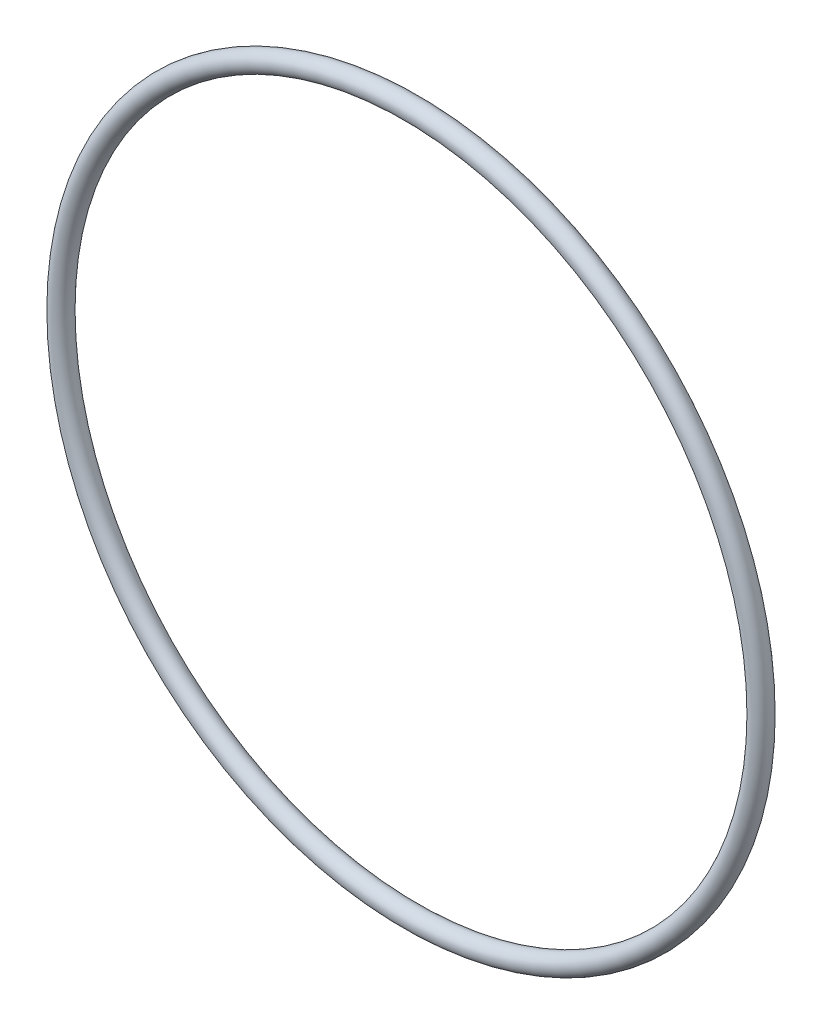
ISO-10303-21;
HEADER;
FILE_DESCRIPTION(('STEP AP214'),'2;1');
FILE_NAME('part.step','',(''),(''),'','','');
FILE_SCHEMA(('AUTOMOTIVE_DESIGN { 1 0 10303 214 1 1 1 1 }'));
ENDSEC;
DATA;
#1=APPLICATION_CONTEXT('core data for automotive mechanical design processes');
#2=APPLICATION_PROTOCOL_DEFINITION('international standard','automotive_design',2000,#1);
#3=PRODUCT_CONTEXT('',#1,'mechanical');
#4=PRODUCT('Part','Part','',(#3));
#5=PRODUCT_RELATED_PRODUCT_CATEGORY('part','',(#4));
#6=PRODUCT_DEFINITION_FORMATION('','',#4);
#7=PRODUCT_DEFINITION_CONTEXT('part definition',#1,'design');
#8=PRODUCT_DEFINITION('design','',#6,#7);
#9=PRODUCT_DEFINITION_SHAPE('','',#8);
#10=(LENGTH_UNIT() NAMED_UNIT(*) SI_UNIT(.MILLI.,.METRE.));
#11=(NAMED_UNIT(*) PLANE_ANGLE_UNIT() SI_UNIT($,.RADIAN.));
#12=(NAMED_UNIT(*) SI_UNIT($,.STERADIAN.) SOLID_ANGLE_UNIT());
#13=UNCERTAINTY_MEASURE_WITH_UNIT(LENGTH_MEASURE(1.E-05),#10,'distance_accuracy_value','');
#14=(GEOMETRIC_REPRESENTATION_CONTEXT(3) GLOBAL_UNCERTAINTY_ASSIGNED_CONTEXT((#13)) GLOBAL_UNIT_ASSIGNED_CONTEXT((#10,
#11,#12)) REPRESENTATION_CONTEXT('',''));
#15=CARTESIAN_POINT('',(0.,0.,0.));
#16=DIRECTION('',(0.,0.,1.));
#17=DIRECTION('',(1.,0.,0.));
#18=AXIS2_PLACEMENT_3D('',#15,#16,#17);
#19=CARTESIAN_POINT('',(0.,0.,0.));
#20=DIRECTION('',(0.,0.,1.));
#21=DIRECTION('',(1.,0.,0.));
#22=AXIS2_PLACEMENT_3D('',#19,#20,#21);
#23=TOROIDAL_SURFACE('',#22,61.8871,1.7653);
#24=CARTESIAN_POINT('',(63.6524,0.,0.));
#25=VERTEX_POINT('',#24);
#26=VERTEX_LOOP('',#25);
#27=FACE_BOUND('',#26,.T.);
#28=ADVANCED_FACE('F35',(#27),#23,.T.);
#29=CLOSED_SHELL('',(#28));
#30=MANIFOLD_SOLID_BREP('B2',#29);
#31=ADVANCED_BREP_SHAPE_REPRESENTATION('',(#18,#30),#14);
#32=SHAPE_DEFINITION_REPRESENTATION(#9,#31);
ENDSEC;
END-ISO-10303-21;
